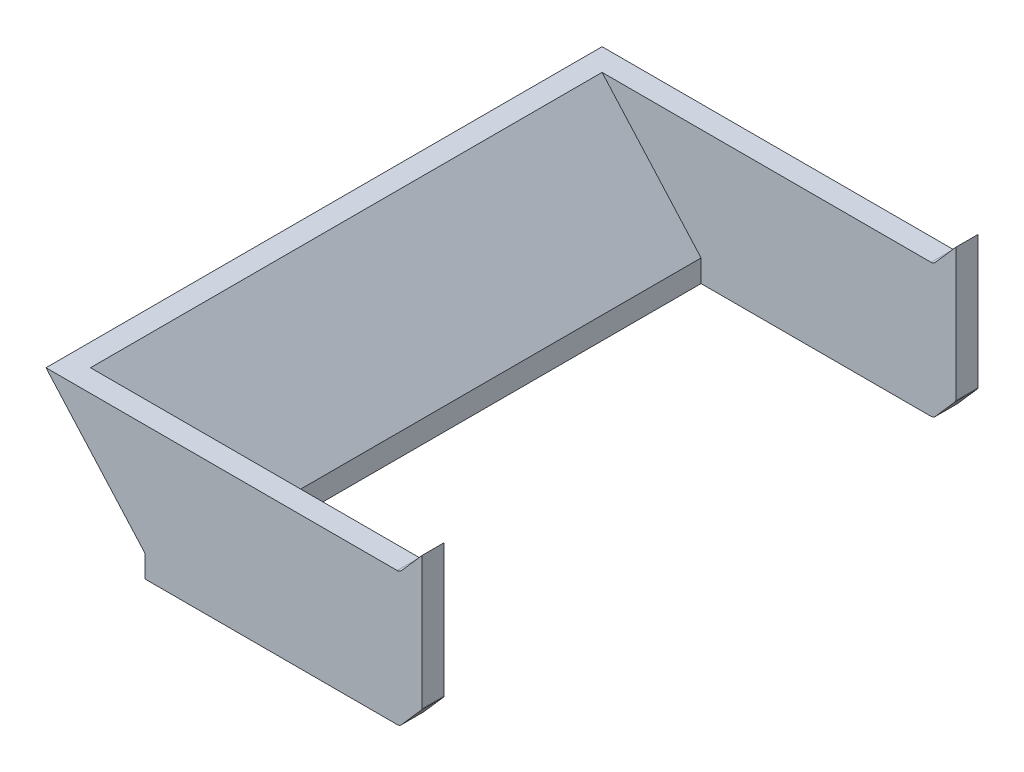
ISO-10303-21;
HEADER;
FILE_DESCRIPTION(('STEP AP214'),'2;1');
FILE_NAME('part.step','',(''),(''),'','','');
FILE_SCHEMA(('AUTOMOTIVE_DESIGN { 1 0 10303 214 1 1 1 1 }'));
ENDSEC;
DATA;
#1=APPLICATION_CONTEXT('core data for automotive mechanical design processes');
#2=APPLICATION_PROTOCOL_DEFINITION('international standard','automotive_design',2000,#1);
#3=PRODUCT_CONTEXT('',#1,'mechanical');
#4=PRODUCT('Part','Part','',(#3));
#5=PRODUCT_RELATED_PRODUCT_CATEGORY('part','',(#4));
#6=PRODUCT_DEFINITION_FORMATION('','',#4);
#7=PRODUCT_DEFINITION_CONTEXT('part definition',#1,'design');
#8=PRODUCT_DEFINITION('design','',#6,#7);
#9=PRODUCT_DEFINITION_SHAPE('','',#8);
#10=(LENGTH_UNIT() NAMED_UNIT(*) SI_UNIT(.MILLI.,.METRE.));
#11=(NAMED_UNIT(*) PLANE_ANGLE_UNIT() SI_UNIT($,.RADIAN.));
#12=(NAMED_UNIT(*) SI_UNIT($,.STERADIAN.) SOLID_ANGLE_UNIT());
#13=UNCERTAINTY_MEASURE_WITH_UNIT(LENGTH_MEASURE(1.E-05),#10,'distance_accuracy_value','');
#14=(GEOMETRIC_REPRESENTATION_CONTEXT(3) GLOBAL_UNCERTAINTY_ASSIGNED_CONTEXT((#13)) GLOBAL_UNIT_ASSIGNED_CONTEXT((#10,
#11,#12)) REPRESENTATION_CONTEXT('',''));
#15=CARTESIAN_POINT('',(0.,0.,0.));
#16=DIRECTION('',(0.,0.,1.));
#17=DIRECTION('',(1.,0.,0.));
#18=AXIS2_PLACEMENT_3D('',#15,#16,#17);
#19=CARTESIAN_POINT('',(2.,12.,-48.));
#20=DIRECTION('',(0.,-1.,0.));
#21=DIRECTION('',(0.,0.,-1.));
#22=AXIS2_PLACEMENT_3D('',#19,#20,#21);
#23=PLANE('',#22);
#24=DIRECTION('',(1.,0.,0.));
#25=VECTOR('',#24,1.);
#26=CARTESIAN_POINT('',(2.,12.,-48.));
#27=LINE('',#26,#25);
#28=CARTESIAN_POINT('',(-20.9,12.,-48.));
#29=VERTEX_POINT('',#28);
#30=CARTESIAN_POINT('',(-0.226533162107664,12.,-48.));
#31=VERTEX_POINT('',#30);
#32=EDGE_CURVE('E73',#29,#31,#27,.T.);
#33=ORIENTED_EDGE('',*,*,#32,.T.);
#34=DIRECTION('',(0.,0.,1.));
#35=VECTOR('',#34,1.);
#36=CARTESIAN_POINT('',(-0.226533162107664,12.,-53.1870754496819));
#37=LINE('',#36,#35);
#38=CARTESIAN_POINT('',(-0.22653316210766,12.,-50.));
#39=VERTEX_POINT('',#38);
#40=EDGE_CURVE('E68',#39,#31,#37,.T.);
#41=ORIENTED_EDGE('',*,*,#40,.F.);
#42=DIRECTION('',(-1.,0.,0.));
#43=VECTOR('',#42,1.);
#44=CARTESIAN_POINT('',(2.,12.,-50.));
#45=LINE('',#44,#43);
#46=CARTESIAN_POINT('',(-31.8,12.,-50.));
#47=VERTEX_POINT('',#46);
#48=EDGE_CURVE('E206',#39,#47,#45,.T.);
#49=ORIENTED_EDGE('',*,*,#48,.T.);
#50=DIRECTION('',(0.,0.,1.));
#51=VECTOR('',#50,1.);
#52=CARTESIAN_POINT('',(-31.8,12.,-50.));
#53=LINE('',#52,#51);
#54=CARTESIAN_POINT('',(-31.8,12.,0.));
#55=VERTEX_POINT('',#54);
#56=EDGE_CURVE('E333',#47,#55,#53,.T.);
#57=ORIENTED_EDGE('',*,*,#56,.T.);
#58=DIRECTION('',(1.,0.,0.));
#59=VECTOR('',#58,1.);
#60=CARTESIAN_POINT('',(2.,12.,0.));
#61=LINE('',#60,#59);
#62=CARTESIAN_POINT('',(-0.226533162107664,12.,0.));
#63=VERTEX_POINT('',#62);
#64=EDGE_CURVE('E249',#55,#63,#61,.T.);
#65=ORIENTED_EDGE('',*,*,#64,.T.);
#66=DIRECTION('',(0.,0.,1.));
#67=VECTOR('',#66,1.);
#68=CARTESIAN_POINT('',(-0.226533162107664,12.,-5.18707544968191));
#69=LINE('',#68,#67);
#70=CARTESIAN_POINT('',(-0.226533162107664,12.,-2.));
#71=VERTEX_POINT('',#70);
#72=EDGE_CURVE('E240',#71,#63,#69,.T.);
#73=ORIENTED_EDGE('',*,*,#72,.F.);
#74=DIRECTION('',(-1.,0.,0.));
#75=VECTOR('',#74,1.);
#76=CARTESIAN_POINT('',(2.,12.,-2.));
#77=LINE('',#76,#75);
#78=CARTESIAN_POINT('',(-20.9,12.,-2.));
#79=VERTEX_POINT('',#78);
#80=EDGE_CURVE('E328',#71,#79,#77,.T.);
#81=ORIENTED_EDGE('',*,*,#80,.T.);
#82=CARTESIAN_POINT('',(-29.8,12.,-2.));
#83=VERTEX_POINT('',#82);
#84=EDGE_CURVE('E327',#79,#83,#77,.T.);
#85=ORIENTED_EDGE('',*,*,#84,.T.);
#86=DIRECTION('',(0.,0.,-1.));
#87=VECTOR('',#86,1.);
#88=CARTESIAN_POINT('',(-29.8,12.,-48.));
#89=LINE('',#88,#87);
#90=CARTESIAN_POINT('',(-29.8,12.,-48.));
#91=VERTEX_POINT('',#90);
#92=EDGE_CURVE('E319',#83,#91,#89,.T.);
#93=ORIENTED_EDGE('',*,*,#92,.T.);
#94=EDGE_CURVE('E325',#91,#29,#27,.T.);
#95=ORIENTED_EDGE('',*,*,#94,.T.);
#96=EDGE_LOOP('',(#33,#41,#49,#57,#65,#73,#81,#85,#93,#95));
#97=FACE_BOUND('',#96,.T.);
#98=ADVANCED_FACE('F51',(#97),#23,.F.);
#99=CARTESIAN_POINT('',(2.,2.35563078294051,-50.));
#100=DIRECTION('',(1.,0.,0.));
#101=DIRECTION('',(0.,0.,-1.));
#102=AXIS2_PLACEMENT_3D('',#99,#100,#101);
#103=PLANE('',#102);
#104=DIRECTION('',(0.,0.,-1.));
#105=VECTOR('',#104,1.);
#106=CARTESIAN_POINT('',(2.,2.35563078294051,-50.));
#107=LINE('',#106,#105);
#108=CARTESIAN_POINT('',(2.,2.35563078294051,0.));
#109=VERTEX_POINT('',#108);
#110=CARTESIAN_POINT('',(2.,2.35563078294051,-2.));
#111=VERTEX_POINT('',#110);
#112=EDGE_CURVE('E528',#109,#111,#107,.T.);
#113=ORIENTED_EDGE('',*,*,#112,.T.);
#114=DIRECTION('',(0.,1.,0.));
#115=VECTOR('',#114,1.);
#116=CARTESIAN_POINT('',(2.,2.,-2.));
#117=LINE('',#116,#115);
#118=CARTESIAN_POINT('',(2.,14.2803508501983,-2.));
#119=VERTEX_POINT('',#118);
#120=EDGE_CURVE('E351',#111,#119,#117,.T.);
#121=ORIENTED_EDGE('',*,*,#120,.T.);
#122=DIRECTION('',(0.,0.,1.));
#123=VECTOR('',#122,1.);
#124=CARTESIAN_POINT('',(2.,14.2803508501983,-5.18707544968191));
#125=LINE('',#124,#123);
#126=CARTESIAN_POINT('',(2.,14.2803508501983,0.));
#127=VERTEX_POINT('',#126);
#128=EDGE_CURVE('E234',#119,#127,#125,.T.);
#129=ORIENTED_EDGE('',*,*,#128,.T.);
#130=DIRECTION('',(0.,1.,0.));
#131=VECTOR('',#130,1.);
#132=CARTESIAN_POINT('',(2.,2.35563078294051,0.));
#133=LINE('',#132,#131);
#134=EDGE_CURVE('E467',#109,#127,#133,.T.);
#135=ORIENTED_EDGE('',*,*,#134,.F.);
#136=EDGE_LOOP('',(#113,#121,#129,#135));
#137=FACE_BOUND('',#136,.T.);
#138=ADVANCED_FACE('F283',(#137),#103,.T.);
#139=CARTESIAN_POINT('',(0.149371543670396,0.170309763302108,-50.));
#140=DIRECTION('',(0.751809411556112,-0.659380473395787,0.));
#141=DIRECTION('',(0.659380473395787,0.751809411556112,0.));
#142=AXIS2_PLACEMENT_3D('',#139,#140,#141);
#143=PLANE('',#142);
#144=DIRECTION('',(-0.659380473395787,-0.751809411556112,0.));
#145=VECTOR('',#144,1.);
#146=CARTESIAN_POINT('',(0.149371543670397,0.17030976330211,-2.));
#147=LINE('',#146,#145);
#148=CARTESIAN_POINT('',(1.95036188231122,2.22375468826135,-2.));
#149=VERTEX_POINT('',#148);
#150=CARTESIAN_POINT('',(0.149371543670396,0.170309763302108,-2.));
#151=VERTEX_POINT('',#150);
#152=EDGE_CURVE('E440',#149,#151,#147,.T.);
#153=ORIENTED_EDGE('',*,*,#152,.F.);
#154=DIRECTION('',(0.,0.,-1.));
#155=VECTOR('',#154,1.);
#156=CARTESIAN_POINT('',(1.95036188231122,2.22375468826135,-50.));
#157=LINE('',#156,#155);
#158=CARTESIAN_POINT('',(1.95036188231122,2.22375468826135,0.));
#159=VERTEX_POINT('',#158);
#160=EDGE_CURVE('E530',#149,#159,#157,.F.);
#161=ORIENTED_EDGE('',*,*,#160,.T.);
#162=DIRECTION('',(0.659380473395787,0.751809411556112,0.));
#163=VECTOR('',#162,1.);
#164=CARTESIAN_POINT('',(0.149371543670396,0.170309763302108,0.));
#165=LINE('',#164,#163);
#166=CARTESIAN_POINT('',(0.149371543670396,0.170309763302108,0.));
#167=VERTEX_POINT('',#166);
#168=EDGE_CURVE('E471',#167,#159,#165,.T.);
#169=ORIENTED_EDGE('',*,*,#168,.F.);
#170=DIRECTION('',(0.,0.,1.));
#171=VECTOR('',#170,1.);
#172=CARTESIAN_POINT('',(0.149371543670396,0.170309763302108,-50.));
#173=LINE('',#172,#171);
#174=EDGE_CURVE('E562',#151,#167,#173,.T.);
#175=ORIENTED_EDGE('',*,*,#174,.F.);
#176=EDGE_LOOP('',(#153,#161,#169,#175));
#177=FACE_BOUND('',#176,.T.);
#178=ADVANCED_FACE('F509',(#177),#143,.T.);
#179=CARTESIAN_POINT('',(-0.226533162107662,0.5,-50.));
#180=DIRECTION('',(0.,0.,1.));
#181=DIRECTION('',(1.,0.,0.));
#182=AXIS2_PLACEMENT_3D('',#179,#180,#181);
#183=CYLINDRICAL_SURFACE('',#182,0.5);
#184=CARTESIAN_POINT('',(-0.226533162107662,0.5,-2.));
#185=DIRECTION('',(0.,0.,1.));
#186=DIRECTION('',(0.,-1.,0.));
#187=AXIS2_PLACEMENT_3D('',#184,#185,#186);
#188=CIRCLE('',#187,0.5);
#189=CARTESIAN_POINT('',(-0.226533162107662,0.,-2.));
#190=VERTEX_POINT('',#189);
#191=EDGE_CURVE('E447',#151,#190,#188,.F.);
#192=ORIENTED_EDGE('',*,*,#191,.F.);
#193=ORIENTED_EDGE('',*,*,#174,.T.);
#194=CARTESIAN_POINT('',(-0.226533162107662,0.5,0.));
#195=DIRECTION('',(0.,0.,1.));
#196=DIRECTION('',(-1.,0.,0.));
#197=AXIS2_PLACEMENT_3D('',#194,#195,#196);
#198=CIRCLE('',#197,0.5);
#199=CARTESIAN_POINT('',(-0.226533162107664,0.,0.));
#200=VERTEX_POINT('',#199);
#201=EDGE_CURVE('E557',#200,#167,#198,.T.);
#202=ORIENTED_EDGE('',*,*,#201,.F.);
#203=DIRECTION('',(0.,0.,1.));
#204=VECTOR('',#203,1.);
#205=CARTESIAN_POINT('',(-0.226533162107664,0.,-50.));
#206=LINE('',#205,#204);
#207=EDGE_CURVE('E564',#190,#200,#206,.T.);
#208=ORIENTED_EDGE('',*,*,#207,.F.);
#209=EDGE_LOOP('',(#192,#193,#202,#208));
#210=FACE_BOUND('',#209,.T.);
#211=ADVANCED_FACE('F504',(#210),#183,.T.);
#212=DIRECTION('',(0.,1.,0.));
#213=VECTOR('',#212,1.);
#214=CARTESIAN_POINT('',(1.99999999999999,2.,-48.));
#215=LINE('',#214,#213);
#216=CARTESIAN_POINT('',(2.,2.35563078294051,-48.));
#217=VERTEX_POINT('',#216);
#218=CARTESIAN_POINT('',(2.,14.2803508501983,-48.));
#219=VERTEX_POINT('',#218);
#220=EDGE_CURVE('E193',#217,#219,#215,.T.);
#221=ORIENTED_EDGE('',*,*,#220,.F.);
#222=DIRECTION('',(0.,0.,-1.));
#223=VECTOR('',#222,1.);
#224=CARTESIAN_POINT('',(2.,2.35563078294051,-50.));
#225=LINE('',#224,#223);
#226=CARTESIAN_POINT('',(2.,2.35563078294051,-50.));
#227=VERTEX_POINT('',#226);
#228=EDGE_CURVE('E526',#217,#227,#225,.T.);
#229=ORIENTED_EDGE('',*,*,#228,.T.);
#230=DIRECTION('',(0.,1.,0.));
#231=VECTOR('',#230,1.);
#232=CARTESIAN_POINT('',(2.,2.35563078294051,-50.));
#233=LINE('',#232,#231);
#234=CARTESIAN_POINT('',(2.,14.2803508501983,-50.));
#235=VERTEX_POINT('',#234);
#236=EDGE_CURVE('E212',#227,#235,#233,.T.);
#237=ORIENTED_EDGE('',*,*,#236,.T.);
#238=DIRECTION('',(0.,0.,1.));
#239=VECTOR('',#238,1.);
#240=CARTESIAN_POINT('',(2.,14.2803508501983,-53.1870754496819));
#241=LINE('',#240,#239);
#242=EDGE_CURVE('E209',#235,#219,#241,.T.);
#243=ORIENTED_EDGE('',*,*,#242,.T.);
#244=EDGE_LOOP('',(#221,#229,#237,#243));
#245=FACE_BOUND('',#244,.T.);
#246=ADVANCED_FACE('F210',(#245),#103,.T.);
#247=CARTESIAN_POINT('',(-0.226533162107662,0.5,-50.));
#248=DIRECTION('',(0.,0.,-1.));
#249=DIRECTION('',(-1.,0.,0.));
#250=AXIS2_PLACEMENT_3D('',#247,#248,#249);
#251=PLANE('',#250);
#252=ORIENTED_EDGE('',*,*,#236,.F.);
#253=CARTESIAN_POINT('',(1.8,2.35563078294051,-50.));
#254=DIRECTION('',(0.,0.,-1.));
#255=DIRECTION('',(-1.,0.,0.));
#256=AXIS2_PLACEMENT_3D('',#253,#254,#255);
#257=CIRCLE('',#256,0.2);
#258=CARTESIAN_POINT('',(1.95036188231122,2.22375468826135,-50.));
#259=VERTEX_POINT('',#258);
#260=EDGE_CURVE('E527',#227,#259,#257,.T.);
#261=ORIENTED_EDGE('',*,*,#260,.T.);
#262=DIRECTION('',(0.659380473395787,0.751809411556112,0.));
#263=VECTOR('',#262,1.);
#264=CARTESIAN_POINT('',(0.149371543670396,0.170309763302108,-50.));
#265=LINE('',#264,#263);
#266=CARTESIAN_POINT('',(0.149371543670396,0.170309763302108,-50.));
#267=VERTEX_POINT('',#266);
#268=EDGE_CURVE('E540',#267,#259,#265,.T.);
#269=ORIENTED_EDGE('',*,*,#268,.F.);
#270=CARTESIAN_POINT('',(-0.226533162107662,0.5,-50.));
#271=DIRECTION('',(0.,0.,1.));
#272=DIRECTION('',(-1.,0.,0.));
#273=AXIS2_PLACEMENT_3D('',#270,#271,#272);
#274=CIRCLE('',#273,0.5);
#275=CARTESIAN_POINT('',(-0.226533162107664,0.,-50.));
#276=VERTEX_POINT('',#275);
#277=EDGE_CURVE('E545',#276,#267,#274,.T.);
#278=ORIENTED_EDGE('',*,*,#277,.F.);
#279=DIRECTION('',(1.,0.,0.));
#280=VECTOR('',#279,1.);
#281=CARTESIAN_POINT('',(-0.226533162107664,0.,-50.));
#282=LINE('',#281,#280);
#283=CARTESIAN_POINT('',(-22.9,0.,-50.));
#284=VERTEX_POINT('',#283);
#285=EDGE_CURVE('E480',#284,#276,#282,.T.);
#286=ORIENTED_EDGE('',*,*,#285,.F.);
#287=DIRECTION('',(0.,-1.,0.));
#288=VECTOR('',#287,1.);
#289=CARTESIAN_POINT('',(-22.9,2.,-50.));
#290=LINE('',#289,#288);
#291=CARTESIAN_POINT('',(-22.9,2.,-50.));
#292=VERTEX_POINT('',#291);
#293=EDGE_CURVE('E470',#292,#284,#290,.T.);
#294=ORIENTED_EDGE('',*,*,#293,.F.);
#295=DIRECTION('',(-0.66482736433038,0.746997038573461,0.));
#296=VECTOR('',#295,1.);
#297=CARTESIAN_POINT('',(-22.9,2.,-50.));
#298=LINE('',#297,#296);
#299=EDGE_CURVE('E374',#292,#47,#298,.T.);
#300=ORIENTED_EDGE('',*,*,#299,.T.);
#301=ORIENTED_EDGE('',*,*,#48,.F.);
#302=CARTESIAN_POINT('',(-0.226533162107662,12.5,-50.));
#303=DIRECTION('',(0.,0.,-1.));
#304=DIRECTION('',(-1.,0.,0.));
#305=AXIS2_PLACEMENT_3D('',#302,#303,#304);
#306=CIRCLE('',#305,0.499999999999999);
#307=CARTESIAN_POINT('',(0.149371543670395,12.1703097633021,-50.));
#308=VERTEX_POINT('',#307);
#309=EDGE_CURVE('E224',#308,#39,#306,.T.);
#310=ORIENTED_EDGE('',*,*,#309,.F.);
#311=DIRECTION('',(-0.659380473395787,-0.751809411556112,0.));
#312=VECTOR('',#311,1.);
#313=CARTESIAN_POINT('',(0.149371543670396,12.1703097633021,-50.));
#314=LINE('',#313,#312);
#315=EDGE_CURVE('E216',#235,#308,#314,.T.);
#316=ORIENTED_EDGE('',*,*,#315,.F.);
#317=EDGE_LOOP('',(#252,#261,#269,#278,#286,#294,#300,#301,#310,#316));
#318=FACE_BOUND('',#317,.T.);
#319=ADVANCED_FACE('F286',(#318),#251,.T.);
#320=CARTESIAN_POINT('',(-0.226533162107662,0.5,0.));
#321=DIRECTION('',(0.,0.,-1.));
#322=DIRECTION('',(-1.,0.,0.));
#323=AXIS2_PLACEMENT_3D('',#320,#321,#322);
#324=PLANE('',#323);
#325=ORIENTED_EDGE('',*,*,#168,.T.);
#326=CARTESIAN_POINT('',(1.8,2.35563078294051,0.));
#327=DIRECTION('',(0.,0.,-1.));
#328=DIRECTION('',(-1.,0.,0.));
#329=AXIS2_PLACEMENT_3D('',#326,#327,#328);
#330=CIRCLE('',#329,0.2);
#331=EDGE_CURVE('E12',#159,#109,#330,.F.);
#332=ORIENTED_EDGE('',*,*,#331,.T.);
#333=ORIENTED_EDGE('',*,*,#134,.T.);
#334=DIRECTION('',(-0.659380473395787,-0.751809411556112,0.));
#335=VECTOR('',#334,1.);
#336=CARTESIAN_POINT('',(0.149371543670396,12.1703097633021,0.));
#337=LINE('',#336,#335);
#338=CARTESIAN_POINT('',(0.149371543670395,12.1703097633021,0.));
#339=VERTEX_POINT('',#338);
#340=EDGE_CURVE('E229',#127,#339,#337,.T.);
#341=ORIENTED_EDGE('',*,*,#340,.T.);
#342=CARTESIAN_POINT('',(-0.226533162107662,12.5,0.));
#343=DIRECTION('',(0.,0.,-1.));
#344=DIRECTION('',(1.,0.,0.));
#345=AXIS2_PLACEMENT_3D('',#342,#343,#344);
#346=CIRCLE('',#345,0.499999999999999);
#347=EDGE_CURVE('E237',#339,#63,#346,.T.);
#348=ORIENTED_EDGE('',*,*,#347,.T.);
#349=ORIENTED_EDGE('',*,*,#64,.F.);
#350=DIRECTION('',(-0.66482736433038,0.746997038573461,0.));
#351=VECTOR('',#350,1.);
#352=CARTESIAN_POINT('',(-22.9,2.,0.));
#353=LINE('',#352,#351);
#354=CARTESIAN_POINT('',(-22.9,2.,0.));
#355=VERTEX_POINT('',#354);
#356=EDGE_CURVE('E358',#355,#55,#353,.T.);
#357=ORIENTED_EDGE('',*,*,#356,.F.);
#358=DIRECTION('',(0.,-1.,0.));
#359=VECTOR('',#358,1.);
#360=CARTESIAN_POINT('',(-22.9,2.,0.));
#361=LINE('',#360,#359);
#362=CARTESIAN_POINT('',(-22.9,0.,0.));
#363=VERTEX_POINT('',#362);
#364=EDGE_CURVE('E481',#355,#363,#361,.T.);
#365=ORIENTED_EDGE('',*,*,#364,.T.);
#366=DIRECTION('',(1.,0.,0.));
#367=VECTOR('',#366,1.);
#368=CARTESIAN_POINT('',(-0.226533162107664,0.,0.));
#369=LINE('',#368,#367);
#370=EDGE_CURVE('E484',#363,#200,#369,.T.);
#371=ORIENTED_EDGE('',*,*,#370,.T.);
#372=ORIENTED_EDGE('',*,*,#201,.T.);
#373=EDGE_LOOP('',(#325,#332,#333,#341,#348,#349,#357,#365,#371,#372));
#374=FACE_BOUND('',#373,.T.);
#375=ADVANCED_FACE('F492',(#374),#324,.F.);
#376=DIRECTION('',(0.659380473395787,0.751809411556112,0.));
#377=VECTOR('',#376,1.);
#378=CARTESIAN_POINT('',(0.149371543670395,0.170309763302107,-48.));
#379=LINE('',#378,#377);
#380=CARTESIAN_POINT('',(0.149371543670396,0.170309763302108,-48.));
#381=VERTEX_POINT('',#380);
#382=CARTESIAN_POINT('',(1.95036188231122,2.22375468826135,-48.));
#383=VERTEX_POINT('',#382);
#384=EDGE_CURVE('E449',#381,#383,#379,.T.);
#385=ORIENTED_EDGE('',*,*,#384,.F.);
#386=EDGE_CURVE('E541',#267,#381,#173,.T.);
#387=ORIENTED_EDGE('',*,*,#386,.F.);
#388=ORIENTED_EDGE('',*,*,#268,.T.);
#389=DIRECTION('',(0.,0.,-1.));
#390=VECTOR('',#389,1.);
#391=CARTESIAN_POINT('',(1.95036188231122,2.22375468826135,-50.));
#392=LINE('',#391,#390);
#393=EDGE_CURVE('E60',#259,#383,#392,.F.);
#394=ORIENTED_EDGE('',*,*,#393,.T.);
#395=EDGE_LOOP('',(#385,#387,#388,#394));
#396=FACE_BOUND('',#395,.T.);
#397=ADVANCED_FACE('F501',(#396),#143,.T.);
#398=CARTESIAN_POINT('',(-22.9,2.,-50.));
#399=DIRECTION('',(-1.,0.,0.));
#400=DIRECTION('',(0.,0.,1.));
#401=AXIS2_PLACEMENT_3D('',#398,#399,#400);
#402=PLANE('',#401);
#403=ORIENTED_EDGE('',*,*,#364,.F.);
#404=DIRECTION('',(0.,0.,1.));
#405=VECTOR('',#404,1.);
#406=CARTESIAN_POINT('',(-22.9,2.,0.));
#407=LINE('',#406,#405);
#408=EDGE_CURVE('E464',#292,#355,#407,.T.);
#409=ORIENTED_EDGE('',*,*,#408,.F.);
#410=ORIENTED_EDGE('',*,*,#293,.T.);
#411=DIRECTION('',(0.,0.,1.));
#412=VECTOR('',#411,1.);
#413=CARTESIAN_POINT('',(-22.9,0.,-50.));
#414=LINE('',#413,#412);
#415=EDGE_CURVE('E546',#284,#363,#414,.T.);
#416=ORIENTED_EDGE('',*,*,#415,.T.);
#417=EDGE_LOOP('',(#403,#409,#410,#416));
#418=FACE_BOUND('',#417,.T.);
#419=ADVANCED_FACE('F507',(#418),#402,.T.);
#420=CARTESIAN_POINT('',(-0.226533162107662,0.5,-48.));
#421=DIRECTION('',(0.,0.,-1.));
#422=DIRECTION('',(0.,1.,0.));
#423=AXIS2_PLACEMENT_3D('',#420,#421,#422);
#424=CIRCLE('',#423,0.5);
#425=CARTESIAN_POINT('',(-0.226533162107664,0.,-48.));
#426=VERTEX_POINT('',#425);
#427=EDGE_CURVE('E452',#426,#381,#424,.F.);
#428=ORIENTED_EDGE('',*,*,#427,.F.);
#429=EDGE_CURVE('E563',#276,#426,#206,.T.);
#430=ORIENTED_EDGE('',*,*,#429,.F.);
#431=ORIENTED_EDGE('',*,*,#277,.T.);
#432=ORIENTED_EDGE('',*,*,#386,.T.);
#433=EDGE_LOOP('',(#428,#430,#431,#432));
#434=FACE_BOUND('',#433,.T.);
#435=ADVANCED_FACE('F510',(#434),#183,.T.);
#436=CARTESIAN_POINT('',(-0.226533162107664,0.,-50.));
#437=DIRECTION('',(0.,-1.,0.));
#438=DIRECTION('',(1.,0.,0.));
#439=AXIS2_PLACEMENT_3D('',#436,#437,#438);
#440=PLANE('',#439);
#441=DIRECTION('',(-1.,0.,0.));
#442=VECTOR('',#441,1.);
#443=CARTESIAN_POINT('',(-0.226533162107664,0.,-2.));
#444=LINE('',#443,#442);
#445=CARTESIAN_POINT('',(-20.9,0.,-2.));
#446=VERTEX_POINT('',#445);
#447=EDGE_CURVE('E435',#190,#446,#444,.T.);
#448=ORIENTED_EDGE('',*,*,#447,.F.);
#449=ORIENTED_EDGE('',*,*,#207,.T.);
#450=ORIENTED_EDGE('',*,*,#370,.F.);
#451=ORIENTED_EDGE('',*,*,#415,.F.);
#452=ORIENTED_EDGE('',*,*,#285,.T.);
#453=ORIENTED_EDGE('',*,*,#429,.T.);
#454=DIRECTION('',(1.,0.,0.));
#455=VECTOR('',#454,1.);
#456=CARTESIAN_POINT('',(-0.226533162107664,0.,-48.));
#457=LINE('',#456,#455);
#458=CARTESIAN_POINT('',(-20.9,0.,-48.));
#459=VERTEX_POINT('',#458);
#460=EDGE_CURVE('E453',#459,#426,#457,.T.);
#461=ORIENTED_EDGE('',*,*,#460,.F.);
#462=DIRECTION('',(0.,0.,1.));
#463=VECTOR('',#462,1.);
#464=CARTESIAN_POINT('',(-20.9,0.,-50.));
#465=LINE('',#464,#463);
#466=EDGE_CURVE('E346',#459,#446,#465,.T.);
#467=ORIENTED_EDGE('',*,*,#466,.T.);
#468=EDGE_LOOP('',(#448,#449,#450,#451,#452,#453,#461,#467));
#469=FACE_BOUND('',#468,.T.);
#470=ADVANCED_FACE('F409',(#469),#440,.T.);
#471=CARTESIAN_POINT('',(-29.8,12.,-2.));
#472=DIRECTION('',(0.,0.,1.));
#473=DIRECTION('',(0.,-1.,0.));
#474=AXIS2_PLACEMENT_3D('',#471,#472,#473);
#475=PLANE('',#474);
#476=DIRECTION('',(0.,-1.,0.));
#477=VECTOR('',#476,1.);
#478=CARTESIAN_POINT('',(-20.9,4.,-2.));
#479=LINE('',#478,#477);
#480=CARTESIAN_POINT('',(-20.9,2.,-2.));
#481=VERTEX_POINT('',#480);
#482=EDGE_CURVE('E257',#481,#446,#479,.T.);
#483=ORIENTED_EDGE('',*,*,#482,.F.);
#484=DIRECTION('',(-0.66482736433038,0.746997038573461,0.));
#485=VECTOR('',#484,1.);
#486=CARTESIAN_POINT('',(-20.9,2.,-2.));
#487=LINE('',#486,#485);
#488=EDGE_CURVE('E359',#481,#83,#487,.T.);
#489=ORIENTED_EDGE('',*,*,#488,.T.);
#490=ORIENTED_EDGE('',*,*,#84,.F.);
#491=ORIENTED_EDGE('',*,*,#80,.F.);
#492=CARTESIAN_POINT('',(-0.226533162107662,12.5,-2.));
#493=DIRECTION('',(0.,0.,1.));
#494=DIRECTION('',(0.,-1.,0.));
#495=AXIS2_PLACEMENT_3D('',#492,#493,#494);
#496=CIRCLE('',#495,0.499999999999999);
#497=CARTESIAN_POINT('',(0.149371543670395,12.1703097633021,-2.));
#498=VERTEX_POINT('',#497);
#499=EDGE_CURVE('E233',#71,#498,#496,.T.);
#500=ORIENTED_EDGE('',*,*,#499,.T.);
#501=DIRECTION('',(0.659380473395787,0.751809411556112,0.));
#502=VECTOR('',#501,1.);
#503=CARTESIAN_POINT('',(0.149371543670396,12.1703097633021,-2.));
#504=LINE('',#503,#502);
#505=EDGE_CURVE('E230',#498,#119,#504,.T.);
#506=ORIENTED_EDGE('',*,*,#505,.T.);
#507=ORIENTED_EDGE('',*,*,#120,.F.);
#508=CARTESIAN_POINT('',(1.8,2.35563078294051,-2.));
#509=DIRECTION('',(0.,0.,1.));
#510=DIRECTION('',(0.,-1.,0.));
#511=AXIS2_PLACEMENT_3D('',#508,#509,#510);
#512=CIRCLE('',#511,0.2);
#513=EDGE_CURVE('E461',#111,#149,#512,.F.);
#514=ORIENTED_EDGE('',*,*,#513,.T.);
#515=ORIENTED_EDGE('',*,*,#152,.T.);
#516=ORIENTED_EDGE('',*,*,#191,.T.);
#517=ORIENTED_EDGE('',*,*,#447,.T.);
#518=EDGE_LOOP('',(#483,#489,#490,#491,#500,#506,#507,#514,#515,#516,#517));
#519=FACE_BOUND('',#518,.T.);
#520=ADVANCED_FACE('F406',(#519),#475,.F.);
#521=CARTESIAN_POINT('',(2.,12.,-48.));
#522=DIRECTION('',(0.,0.,-1.));
#523=DIRECTION('',(0.,1.,0.));
#524=AXIS2_PLACEMENT_3D('',#521,#522,#523);
#525=PLANE('',#524);
#526=DIRECTION('',(-0.66482736433038,0.746997038573461,0.));
#527=VECTOR('',#526,1.);
#528=CARTESIAN_POINT('',(-20.9,2.,-48.));
#529=LINE('',#528,#527);
#530=CARTESIAN_POINT('',(-20.9,1.99999999999999,-48.));
#531=VERTEX_POINT('',#530);
#532=EDGE_CURVE('E205',#531,#91,#529,.T.);
#533=ORIENTED_EDGE('',*,*,#532,.F.);
#534=DIRECTION('',(0.,1.,0.));
#535=VECTOR('',#534,1.);
#536=CARTESIAN_POINT('',(-20.9,-3.38998246139768,-48.));
#537=LINE('',#536,#535);
#538=EDGE_CURVE('E438',#459,#531,#537,.T.);
#539=ORIENTED_EDGE('',*,*,#538,.F.);
#540=ORIENTED_EDGE('',*,*,#460,.T.);
#541=ORIENTED_EDGE('',*,*,#427,.T.);
#542=ORIENTED_EDGE('',*,*,#384,.T.);
#543=CARTESIAN_POINT('',(1.8,2.35563078294051,-48.));
#544=DIRECTION('',(0.,0.,-1.));
#545=DIRECTION('',(0.,1.,0.));
#546=AXIS2_PLACEMENT_3D('',#543,#544,#545);
#547=CIRCLE('',#546,0.2);
#548=EDGE_CURVE('E201',#383,#217,#547,.F.);
#549=ORIENTED_EDGE('',*,*,#548,.T.);
#550=ORIENTED_EDGE('',*,*,#220,.T.);
#551=DIRECTION('',(-0.659380473395787,-0.751809411556112,0.));
#552=VECTOR('',#551,1.);
#553=CARTESIAN_POINT('',(0.149371543670396,12.1703097633021,-48.));
#554=LINE('',#553,#552);
#555=CARTESIAN_POINT('',(0.149371543670395,12.1703097633021,-48.));
#556=VERTEX_POINT('',#555);
#557=EDGE_CURVE('E199',#219,#556,#554,.T.);
#558=ORIENTED_EDGE('',*,*,#557,.T.);
#559=CARTESIAN_POINT('',(-0.226533162107662,12.5,-48.));
#560=DIRECTION('',(0.,0.,-1.));
#561=DIRECTION('',(1.,0.,0.));
#562=AXIS2_PLACEMENT_3D('',#559,#560,#561);
#563=CIRCLE('',#562,0.499999999999999);
#564=EDGE_CURVE('E222',#556,#31,#563,.T.);
#565=ORIENTED_EDGE('',*,*,#564,.T.);
#566=ORIENTED_EDGE('',*,*,#32,.F.);
#567=ORIENTED_EDGE('',*,*,#94,.F.);
#568=EDGE_LOOP('',(#533,#539,#540,#541,#542,#549,#550,#558,#565,#566,#567));
#569=FACE_BOUND('',#568,.T.);
#570=ADVANCED_FACE('F196',(#569),#525,.F.);
#571=CARTESIAN_POINT('',(-31.8,12.,0.));
#572=DIRECTION('',(0.746997038573461,0.66482736433038,0.));
#573=DIRECTION('',(-0.66482736433038,0.746997038573461,0.));
#574=AXIS2_PLACEMENT_3D('',#571,#572,#573);
#575=PLANE('',#574);
#576=ORIENTED_EDGE('',*,*,#356,.T.);
#577=ORIENTED_EDGE('',*,*,#56,.F.);
#578=ORIENTED_EDGE('',*,*,#299,.F.);
#579=ORIENTED_EDGE('',*,*,#408,.T.);
#580=EDGE_LOOP('',(#576,#577,#578,#579));
#581=FACE_BOUND('',#580,.T.);
#582=ADVANCED_FACE('F394',(#581),#575,.F.);
#583=CARTESIAN_POINT('',(-29.8,12.,-48.));
#584=DIRECTION('',(-0.746997038573461,-0.66482736433038,0.));
#585=DIRECTION('',(0.66482736433038,-0.746997038573461,0.));
#586=AXIS2_PLACEMENT_3D('',#583,#584,#585);
#587=PLANE('',#586);
#588=ORIENTED_EDGE('',*,*,#532,.T.);
#589=ORIENTED_EDGE('',*,*,#92,.F.);
#590=ORIENTED_EDGE('',*,*,#488,.F.);
#591=DIRECTION('',(0.,0.,-1.));
#592=VECTOR('',#591,1.);
#593=CARTESIAN_POINT('',(-20.9,2.,-48.));
#594=LINE('',#593,#592);
#595=EDGE_CURVE('E377',#481,#531,#594,.T.);
#596=ORIENTED_EDGE('',*,*,#595,.T.);
#597=EDGE_LOOP('',(#588,#589,#590,#596));
#598=FACE_BOUND('',#597,.T.);
#599=ADVANCED_FACE('F403',(#598),#587,.F.);
#600=CARTESIAN_POINT('',(1.8,2.35563078294051,-50.));
#601=DIRECTION('',(0.,0.,-1.));
#602=DIRECTION('',(-1.,0.,0.));
#603=AXIS2_PLACEMENT_3D('',#600,#601,#602);
#604=CYLINDRICAL_SURFACE('',#603,0.2);
#605=ORIENTED_EDGE('',*,*,#548,.F.);
#606=ORIENTED_EDGE('',*,*,#393,.F.);
#607=ORIENTED_EDGE('',*,*,#260,.F.);
#608=ORIENTED_EDGE('',*,*,#228,.F.);
#609=EDGE_LOOP('',(#605,#606,#607,#608));
#610=FACE_BOUND('',#609,.T.);
#611=ADVANCED_FACE('F413',(#610),#604,.T.);
#612=CARTESIAN_POINT('',(1.8,2.35563078294051,-50.));
#613=DIRECTION('',(0.,0.,-1.));
#614=DIRECTION('',(-1.,0.,0.));
#615=AXIS2_PLACEMENT_3D('',#612,#613,#614);
#616=CYLINDRICAL_SURFACE('',#615,0.2);
#617=ORIENTED_EDGE('',*,*,#331,.F.);
#618=ORIENTED_EDGE('',*,*,#160,.F.);
#619=ORIENTED_EDGE('',*,*,#513,.F.);
#620=ORIENTED_EDGE('',*,*,#112,.F.);
#621=EDGE_LOOP('',(#617,#618,#619,#620));
#622=FACE_BOUND('',#621,.T.);
#623=ADVANCED_FACE('F53',(#622),#616,.T.);
#624=CARTESIAN_POINT('',(-20.9,-3.38998246139768,-2.));
#625=DIRECTION('',(1.,0.,0.));
#626=DIRECTION('',(0.,0.,-1.));
#627=AXIS2_PLACEMENT_3D('',#624,#625,#626);
#628=PLANE('',#627);
#629=ORIENTED_EDGE('',*,*,#538,.T.);
#630=ORIENTED_EDGE('',*,*,#595,.F.);
#631=ORIENTED_EDGE('',*,*,#482,.T.);
#632=ORIENTED_EDGE('',*,*,#466,.F.);
#633=EDGE_LOOP('',(#629,#630,#631,#632));
#634=FACE_BOUND('',#633,.T.);
#635=ADVANCED_FACE('F404',(#634),#628,.T.);
#636=CARTESIAN_POINT('',(0.149371543670396,12.1703097633021,-5.18707544968191));
#637=DIRECTION('',(-0.751809411556112,0.659380473395787,0.));
#638=DIRECTION('',(-0.659380473395787,-0.751809411556112,0.));
#639=AXIS2_PLACEMENT_3D('',#636,#637,#638);
#640=PLANE('',#639);
#641=ORIENTED_EDGE('',*,*,#505,.F.);
#642=DIRECTION('',(0.,0.,1.));
#643=VECTOR('',#642,1.);
#644=CARTESIAN_POINT('',(0.149371543670395,12.1703097633021,-5.18707544968191));
#645=LINE('',#644,#643);
#646=EDGE_CURVE('E243',#498,#339,#645,.T.);
#647=ORIENTED_EDGE('',*,*,#646,.T.);
#648=ORIENTED_EDGE('',*,*,#340,.F.);
#649=ORIENTED_EDGE('',*,*,#128,.F.);
#650=EDGE_LOOP('',(#641,#647,#648,#649));
#651=FACE_BOUND('',#650,.T.);
#652=ADVANCED_FACE('F590',(#651),#640,.T.);
#653=CARTESIAN_POINT('',(-0.226533162107662,12.5,-5.18707544968191));
#654=DIRECTION('',(0.,0.,1.));
#655=DIRECTION('',(1.,0.,0.));
#656=AXIS2_PLACEMENT_3D('',#653,#654,#655);
#657=CYLINDRICAL_SURFACE('',#656,0.499999999999999);
#658=ORIENTED_EDGE('',*,*,#499,.F.);
#659=ORIENTED_EDGE('',*,*,#72,.T.);
#660=ORIENTED_EDGE('',*,*,#347,.F.);
#661=ORIENTED_EDGE('',*,*,#646,.F.);
#662=EDGE_LOOP('',(#658,#659,#660,#661));
#663=FACE_BOUND('',#662,.T.);
#664=ADVANCED_FACE('F595',(#663),#657,.F.);
#665=CARTESIAN_POINT('',(-0.226533162107662,12.5,-53.1870754496819));
#666=DIRECTION('',(0.,0.,1.));
#667=DIRECTION('',(1.,0.,0.));
#668=AXIS2_PLACEMENT_3D('',#665,#666,#667);
#669=CYLINDRICAL_SURFACE('',#668,0.499999999999999);
#670=DIRECTION('',(0.,0.,1.));
#671=VECTOR('',#670,1.);
#672=CARTESIAN_POINT('',(0.149371543670395,12.1703097633021,-53.1870754496819));
#673=LINE('',#672,#671);
#674=EDGE_CURVE('E220',#308,#556,#673,.T.);
#675=ORIENTED_EDGE('',*,*,#674,.F.);
#676=ORIENTED_EDGE('',*,*,#309,.T.);
#677=ORIENTED_EDGE('',*,*,#40,.T.);
#678=ORIENTED_EDGE('',*,*,#564,.F.);
#679=EDGE_LOOP('',(#675,#676,#677,#678));
#680=FACE_BOUND('',#679,.T.);
#681=ADVANCED_FACE('F342',(#680),#669,.F.);
#682=CARTESIAN_POINT('',(0.149371543670396,12.1703097633021,-53.1870754496819));
#683=DIRECTION('',(-0.751809411556112,0.659380473395787,0.));
#684=DIRECTION('',(-0.659380473395787,-0.751809411556112,0.));
#685=AXIS2_PLACEMENT_3D('',#682,#683,#684);
#686=PLANE('',#685);
#687=ORIENTED_EDGE('',*,*,#242,.F.);
#688=ORIENTED_EDGE('',*,*,#315,.T.);
#689=ORIENTED_EDGE('',*,*,#674,.T.);
#690=ORIENTED_EDGE('',*,*,#557,.F.);
#691=EDGE_LOOP('',(#687,#688,#689,#690));
#692=FACE_BOUND('',#691,.T.);
#693=ADVANCED_FACE('F218',(#692),#686,.T.);
#694=CLOSED_SHELL('',(#98,#138,#178,#211,#246,#319,#375,#397,#419,#435,#470,#520,#570,#582,#599,
#611,#623,#635,#652,#664,#681,#693));
#695=MANIFOLD_SOLID_BREP('B2',#694);
#696=ADVANCED_BREP_SHAPE_REPRESENTATION('',(#18,#695),#14);
#697=SHAPE_DEFINITION_REPRESENTATION(#9,#696);
ENDSEC;
END-ISO-10303-21;
